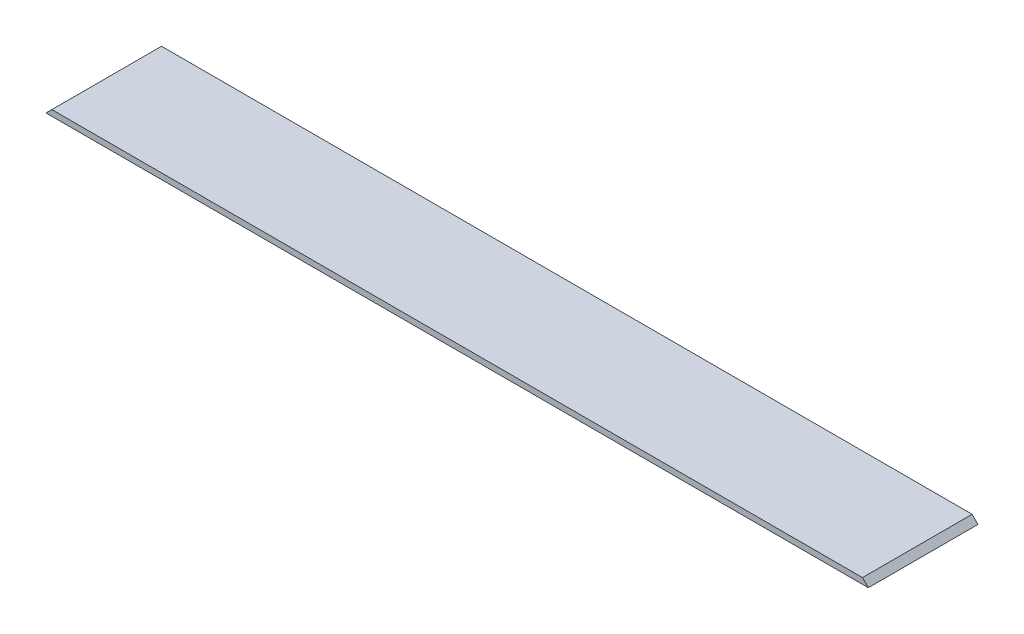
ISO-10303-21;
HEADER;
FILE_DESCRIPTION(('STEP AP214'),'2;1');
FILE_NAME('part.step','',(''),(''),'','','');
FILE_SCHEMA(('AUTOMOTIVE_DESIGN { 1 0 10303 214 1 1 1 1 }'));
ENDSEC;
DATA;
#1=APPLICATION_CONTEXT('core data for automotive mechanical design processes');
#2=APPLICATION_PROTOCOL_DEFINITION('international standard','automotive_design',2000,#1);
#3=PRODUCT_CONTEXT('',#1,'mechanical');
#4=PRODUCT('Part','Part','',(#3));
#5=PRODUCT_RELATED_PRODUCT_CATEGORY('part','',(#4));
#6=PRODUCT_DEFINITION_FORMATION('','',#4);
#7=PRODUCT_DEFINITION_CONTEXT('part definition',#1,'design');
#8=PRODUCT_DEFINITION('design','',#6,#7);
#9=PRODUCT_DEFINITION_SHAPE('','',#8);
#10=(LENGTH_UNIT() NAMED_UNIT(*) SI_UNIT(.MILLI.,.METRE.));
#11=(NAMED_UNIT(*) PLANE_ANGLE_UNIT() SI_UNIT($,.RADIAN.));
#12=(NAMED_UNIT(*) SI_UNIT($,.STERADIAN.) SOLID_ANGLE_UNIT());
#13=UNCERTAINTY_MEASURE_WITH_UNIT(LENGTH_MEASURE(1.E-05),#10,'distance_accuracy_value','');
#14=(GEOMETRIC_REPRESENTATION_CONTEXT(3) GLOBAL_UNCERTAINTY_ASSIGNED_CONTEXT((#13)) GLOBAL_UNIT_ASSIGNED_CONTEXT((#10,
#11,#12)) REPRESENTATION_CONTEXT('',''));
#15=CARTESIAN_POINT('',(0.,0.,0.));
#16=DIRECTION('',(0.,0.,1.));
#17=DIRECTION('',(1.,0.,0.));
#18=AXIS2_PLACEMENT_3D('',#15,#16,#17);
#19=CARTESIAN_POINT('',(1333.5,9.525,177.8));
#20=DIRECTION('',(0.,0.,-1.));
#21=DIRECTION('',(-1.,0.,0.));
#22=AXIS2_PLACEMENT_3D('',#19,#20,#21);
#23=PLANE('',#22);
#24=DIRECTION('',(1.,0.,0.));
#25=VECTOR('',#24,1.);
#26=CARTESIAN_POINT('',(1333.5,-9.525,177.8));
#27=LINE('',#26,#25);
#28=CARTESIAN_POINT('',(-1333.5,-9.525,177.8));
#29=VERTEX_POINT('',#28);
#30=CARTESIAN_POINT('',(1333.5,-9.525,177.8));
#31=VERTEX_POINT('',#30);
#32=EDGE_CURVE('E74',#29,#31,#27,.T.);
#33=ORIENTED_EDGE('',*,*,#32,.T.);
#34=DIRECTION('',(-0.707106781186547,0.707106781186547,0.));
#35=VECTOR('',#34,1.);
#36=CARTESIAN_POINT('',(1314.45,9.52499999999999,177.8));
#37=LINE('',#36,#35);
#38=CARTESIAN_POINT('',(1314.45,9.525,177.8));
#39=VERTEX_POINT('',#38);
#40=EDGE_CURVE('E11',#31,#39,#37,.T.);
#41=ORIENTED_EDGE('',*,*,#40,.T.);
#42=DIRECTION('',(1.,0.,0.));
#43=VECTOR('',#42,1.);
#44=CARTESIAN_POINT('',(1333.5,9.525,177.8));
#45=LINE('',#44,#43);
#46=CARTESIAN_POINT('',(-1314.45,9.525,177.8));
#47=VERTEX_POINT('',#46);
#48=EDGE_CURVE('E77',#47,#39,#45,.T.);
#49=ORIENTED_EDGE('',*,*,#48,.F.);
#50=DIRECTION('',(-0.707106781186547,-0.707106781186547,0.));
#51=VECTOR('',#50,1.);
#52=CARTESIAN_POINT('',(-1314.45,9.52500000000001,177.8));
#53=LINE('',#52,#51);
#54=EDGE_CURVE('E40',#47,#29,#53,.T.);
#55=ORIENTED_EDGE('',*,*,#54,.T.);
#56=EDGE_LOOP('',(#33,#41,#49,#55));
#57=FACE_BOUND('',#56,.T.);
#58=ADVANCED_FACE('F32',(#57),#23,.F.);
#59=CARTESIAN_POINT('',(1333.5,9.525,-177.8));
#60=DIRECTION('',(0.,0.,1.));
#61=DIRECTION('',(1.,0.,0.));
#62=AXIS2_PLACEMENT_3D('',#59,#60,#61);
#63=PLANE('',#62);
#64=DIRECTION('',(-1.,0.,0.));
#65=VECTOR('',#64,1.);
#66=CARTESIAN_POINT('',(1333.5,9.525,-177.8));
#67=LINE('',#66,#65);
#68=CARTESIAN_POINT('',(1314.45,9.525,-177.8));
#69=VERTEX_POINT('',#68);
#70=CARTESIAN_POINT('',(-1314.45,9.525,-177.8));
#71=VERTEX_POINT('',#70);
#72=EDGE_CURVE('E92',#69,#71,#67,.T.);
#73=ORIENTED_EDGE('',*,*,#72,.F.);
#74=DIRECTION('',(0.707106781186547,-0.707106781186547,0.));
#75=VECTOR('',#74,1.);
#76=CARTESIAN_POINT('',(1314.45,9.52500000000001,-177.8));
#77=LINE('',#76,#75);
#78=CARTESIAN_POINT('',(1333.5,-9.525,-177.8));
#79=VERTEX_POINT('',#78);
#80=EDGE_CURVE('E55',#69,#79,#77,.T.);
#81=ORIENTED_EDGE('',*,*,#80,.T.);
#82=DIRECTION('',(-1.,0.,0.));
#83=VECTOR('',#82,1.);
#84=CARTESIAN_POINT('',(1333.5,-9.525,-177.8));
#85=LINE('',#84,#83);
#86=CARTESIAN_POINT('',(-1333.5,-9.525,-177.8));
#87=VERTEX_POINT('',#86);
#88=EDGE_CURVE('E96',#79,#87,#85,.T.);
#89=ORIENTED_EDGE('',*,*,#88,.T.);
#90=DIRECTION('',(0.707106781186547,0.707106781186547,0.));
#91=VECTOR('',#90,1.);
#92=CARTESIAN_POINT('',(-1314.45,9.52499999999999,-177.8));
#93=LINE('',#92,#91);
#94=EDGE_CURVE('E47',#87,#71,#93,.T.);
#95=ORIENTED_EDGE('',*,*,#94,.T.);
#96=EDGE_LOOP('',(#73,#81,#89,#95));
#97=FACE_BOUND('',#96,.T.);
#98=ADVANCED_FACE('F103',(#97),#63,.F.);
#99=CARTESIAN_POINT('',(0.,9.525,0.));
#100=DIRECTION('',(0.,1.,0.));
#101=DIRECTION('',(0.,0.,1.));
#102=AXIS2_PLACEMENT_3D('',#99,#100,#101);
#103=PLANE('',#102);
#104=ORIENTED_EDGE('',*,*,#48,.T.);
#105=DIRECTION('',(0.,0.,-1.));
#106=VECTOR('',#105,1.);
#107=CARTESIAN_POINT('',(1314.45,9.525,-177.8));
#108=LINE('',#107,#106);
#109=EDGE_CURVE('E100',#39,#69,#108,.T.);
#110=ORIENTED_EDGE('',*,*,#109,.T.);
#111=ORIENTED_EDGE('',*,*,#72,.T.);
#112=DIRECTION('',(0.,0.,1.));
#113=VECTOR('',#112,1.);
#114=CARTESIAN_POINT('',(-1314.45,9.525,177.8));
#115=LINE('',#114,#113);
#116=EDGE_CURVE('E98',#71,#47,#115,.T.);
#117=ORIENTED_EDGE('',*,*,#116,.T.);
#118=EDGE_LOOP('',(#104,#110,#111,#117));
#119=FACE_BOUND('',#118,.T.);
#120=ADVANCED_FACE('F106',(#119),#103,.T.);
#121=CARTESIAN_POINT('',(0.,-9.525,0.));
#122=DIRECTION('',(0.,1.,0.));
#123=DIRECTION('',(0.,0.,1.));
#124=AXIS2_PLACEMENT_3D('',#121,#122,#123);
#125=PLANE('',#124);
#126=DIRECTION('',(0.,0.,1.));
#127=VECTOR('',#126,1.);
#128=CARTESIAN_POINT('',(-1333.5,-9.525,177.8));
#129=LINE('',#128,#127);
#130=EDGE_CURVE('E86',#87,#29,#129,.T.);
#131=ORIENTED_EDGE('',*,*,#130,.F.);
#132=ORIENTED_EDGE('',*,*,#88,.F.);
#133=DIRECTION('',(0.,0.,-1.));
#134=VECTOR('',#133,1.);
#135=CARTESIAN_POINT('',(1333.5,-9.525,177.8));
#136=LINE('',#135,#134);
#137=EDGE_CURVE('E87',#31,#79,#136,.T.);
#138=ORIENTED_EDGE('',*,*,#137,.F.);
#139=ORIENTED_EDGE('',*,*,#32,.F.);
#140=EDGE_LOOP('',(#131,#132,#138,#139));
#141=FACE_BOUND('',#140,.T.);
#142=ADVANCED_FACE('F84',(#141),#125,.F.);
#143=CARTESIAN_POINT('',(1314.45,9.525,0.));
#144=DIRECTION('',(0.707106781186547,0.707106781186547,0.));
#145=DIRECTION('',(0.,0.,1.));
#146=AXIS2_PLACEMENT_3D('',#143,#144,#145);
#147=PLANE('',#146);
#148=ORIENTED_EDGE('',*,*,#40,.F.);
#149=ORIENTED_EDGE('',*,*,#137,.T.);
#150=ORIENTED_EDGE('',*,*,#80,.F.);
#151=ORIENTED_EDGE('',*,*,#109,.F.);
#152=EDGE_LOOP('',(#148,#149,#150,#151));
#153=FACE_BOUND('',#152,.T.);
#154=ADVANCED_FACE('F104',(#153),#147,.T.);
#155=CARTESIAN_POINT('',(-1314.45,9.525,0.));
#156=DIRECTION('',(-0.707106781186547,0.707106781186547,0.));
#157=DIRECTION('',(0.,0.,-1.));
#158=AXIS2_PLACEMENT_3D('',#155,#156,#157);
#159=PLANE('',#158);
#160=ORIENTED_EDGE('',*,*,#94,.F.);
#161=ORIENTED_EDGE('',*,*,#130,.T.);
#162=ORIENTED_EDGE('',*,*,#54,.F.);
#163=ORIENTED_EDGE('',*,*,#116,.F.);
#164=EDGE_LOOP('',(#160,#161,#162,#163));
#165=FACE_BOUND('',#164,.T.);
#166=ADVANCED_FACE('F34',(#165),#159,.T.);
#167=CLOSED_SHELL('',(#58,#98,#120,#142,#154,#166));
#168=MANIFOLD_SOLID_BREP('B2',#167);
#169=ADVANCED_BREP_SHAPE_REPRESENTATION('',(#18,#168),#14);
#170=SHAPE_DEFINITION_REPRESENTATION(#9,#169);
ENDSEC;
END-ISO-10303-21;
